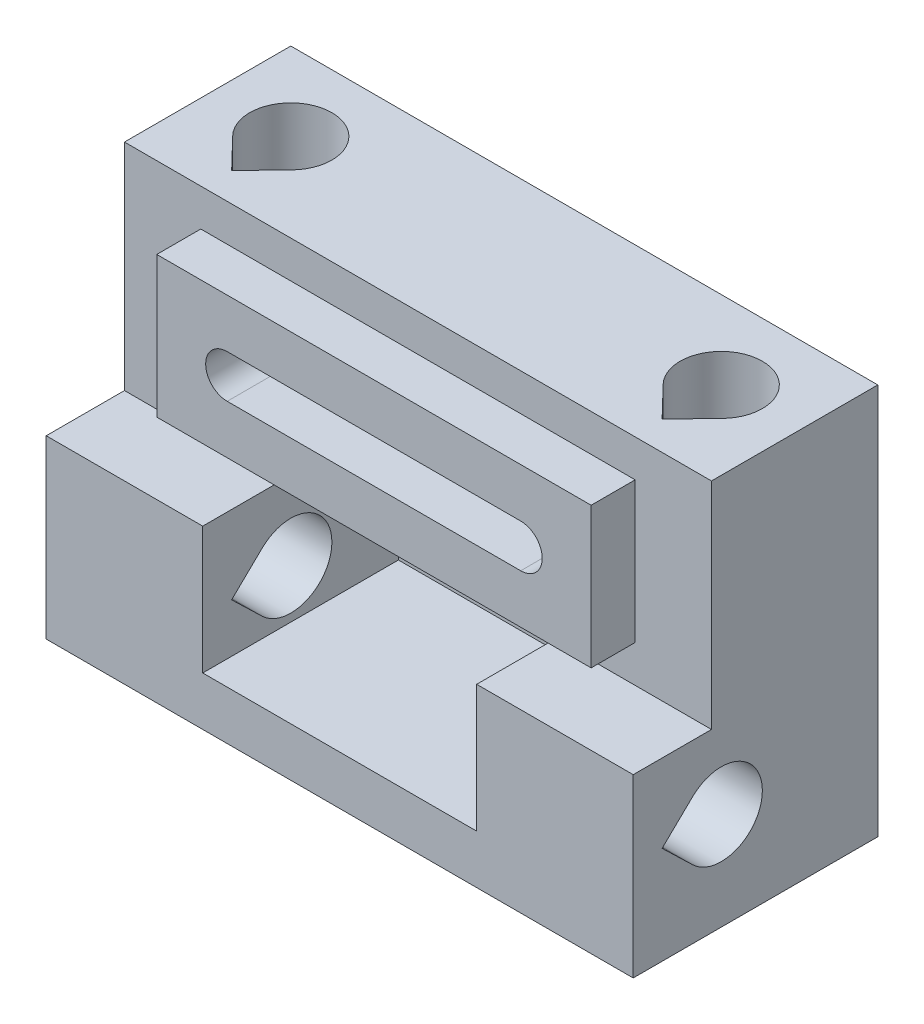
ISO-10303-21;
HEADER;
FILE_DESCRIPTION(('STEP AP214'),'2;1');
FILE_NAME('part.step','',(''),(''),'','','');
FILE_SCHEMA(('AUTOMOTIVE_DESIGN { 1 0 10303 214 1 1 1 1 }'));
ENDSEC;
DATA;
#1=APPLICATION_CONTEXT('core data for automotive mechanical design processes');
#2=APPLICATION_PROTOCOL_DEFINITION('international standard','automotive_design',2000,#1);
#3=PRODUCT_CONTEXT('',#1,'mechanical');
#4=PRODUCT('Part','Part','',(#3));
#5=PRODUCT_RELATED_PRODUCT_CATEGORY('part','',(#4));
#6=PRODUCT_DEFINITION_FORMATION('','',#4);
#7=PRODUCT_DEFINITION_CONTEXT('part definition',#1,'design');
#8=PRODUCT_DEFINITION('design','',#6,#7);
#9=PRODUCT_DEFINITION_SHAPE('','',#8);
#10=(LENGTH_UNIT() NAMED_UNIT(*) SI_UNIT(.MILLI.,.METRE.));
#11=(NAMED_UNIT(*) PLANE_ANGLE_UNIT() SI_UNIT($,.RADIAN.));
#12=(NAMED_UNIT(*) SI_UNIT($,.STERADIAN.) SOLID_ANGLE_UNIT());
#13=UNCERTAINTY_MEASURE_WITH_UNIT(LENGTH_MEASURE(1.E-05),#10,'distance_accuracy_value','');
#14=(GEOMETRIC_REPRESENTATION_CONTEXT(3) GLOBAL_UNCERTAINTY_ASSIGNED_CONTEXT((#13)) GLOBAL_UNIT_ASSIGNED_CONTEXT((#10,
#11,#12)) REPRESENTATION_CONTEXT('',''));
#15=CARTESIAN_POINT('',(0.,0.,0.));
#16=DIRECTION('',(0.,0.,1.));
#17=DIRECTION('',(1.,0.,0.));
#18=AXIS2_PLACEMENT_3D('',#15,#16,#17);
#19=CARTESIAN_POINT('',(-30.,-11.,17.));
#20=DIRECTION('',(0.,0.,1.));
#21=DIRECTION('',(1.,0.,0.));
#22=AXIS2_PLACEMENT_3D('',#19,#20,#21);
#23=PLANE('',#22);
#24=DIRECTION('',(1.,0.,0.));
#25=VECTOR('',#24,1.);
#26=CARTESIAN_POINT('',(-30.,-11.,17.));
#27=LINE('',#26,#25);
#28=CARTESIAN_POINT('',(-30.,-11.,17.));
#29=VERTEX_POINT('',#28);
#30=CARTESIAN_POINT('',(-14.,-11.,17.));
#31=VERTEX_POINT('',#30);
#32=EDGE_CURVE('E595',#29,#31,#27,.T.);
#33=ORIENTED_EDGE('',*,*,#32,.T.);
#34=DIRECTION('',(-1.,0.,0.));
#35=VECTOR('',#34,1.);
#36=CARTESIAN_POINT('',(14.,-11.,17.));
#37=LINE('',#36,#35);
#38=CARTESIAN_POINT('',(14.,-11.,17.));
#39=VERTEX_POINT('',#38);
#40=EDGE_CURVE('E359',#39,#31,#37,.T.);
#41=ORIENTED_EDGE('',*,*,#40,.F.);
#42=DIRECTION('',(-1.,0.,0.));
#43=VECTOR('',#42,1.);
#44=CARTESIAN_POINT('',(30.,-11.,17.));
#45=LINE('',#44,#43);
#46=CARTESIAN_POINT('',(30.,-11.,17.));
#47=VERTEX_POINT('',#46);
#48=EDGE_CURVE('E371',#47,#39,#45,.T.);
#49=ORIENTED_EDGE('',*,*,#48,.F.);
#50=DIRECTION('',(0.,1.,0.));
#51=VECTOR('',#50,1.);
#52=CARTESIAN_POINT('',(30.,-11.,17.));
#53=LINE('',#52,#51);
#54=CARTESIAN_POINT('',(30.,11.,17.));
#55=VERTEX_POINT('',#54);
#56=EDGE_CURVE('E378',#47,#55,#53,.T.);
#57=ORIENTED_EDGE('',*,*,#56,.T.);
#58=DIRECTION('',(-1.,0.,0.));
#59=VECTOR('',#58,1.);
#60=CARTESIAN_POINT('',(30.,11.,17.));
#61=LINE('',#60,#59);
#62=CARTESIAN_POINT('',(-30.,11.,17.));
#63=VERTEX_POINT('',#62);
#64=EDGE_CURVE('E592',#55,#63,#61,.T.);
#65=ORIENTED_EDGE('',*,*,#64,.T.);
#66=DIRECTION('',(0.,-1.,0.));
#67=VECTOR('',#66,1.);
#68=CARTESIAN_POINT('',(-30.,11.,17.));
#69=LINE('',#68,#67);
#70=EDGE_CURVE('E600',#63,#29,#69,.T.);
#71=ORIENTED_EDGE('',*,*,#70,.T.);
#72=EDGE_LOOP('',(#33,#41,#49,#57,#65,#71));
#73=FACE_BOUND('',#72,.T.);
#74=DIRECTION('',(1.,0.,0.));
#75=VECTOR('',#74,1.);
#76=CARTESIAN_POINT('',(22.2,-7.2,17.));
#77=LINE('',#76,#75);
#78=CARTESIAN_POINT('',(-22.2,-7.2,17.));
#79=VERTEX_POINT('',#78);
#80=CARTESIAN_POINT('',(22.2,-7.2,17.));
#81=VERTEX_POINT('',#80);
#82=EDGE_CURVE('E330',#79,#81,#77,.T.);
#83=ORIENTED_EDGE('',*,*,#82,.F.);
#84=DIRECTION('',(0.,-1.,0.));
#85=VECTOR('',#84,1.);
#86=CARTESIAN_POINT('',(-22.2,-7.2,17.));
#87=LINE('',#86,#85);
#88=CARTESIAN_POINT('',(-22.2,7.2,17.));
#89=VERTEX_POINT('',#88);
#90=EDGE_CURVE('E313',#89,#79,#87,.T.);
#91=ORIENTED_EDGE('',*,*,#90,.F.);
#92=DIRECTION('',(-1.,0.,0.));
#93=VECTOR('',#92,1.);
#94=CARTESIAN_POINT('',(-22.2,7.2,17.));
#95=LINE('',#94,#93);
#96=CARTESIAN_POINT('',(22.2,7.2,17.));
#97=VERTEX_POINT('',#96);
#98=EDGE_CURVE('E321',#97,#89,#95,.T.);
#99=ORIENTED_EDGE('',*,*,#98,.F.);
#100=DIRECTION('',(0.,1.,0.));
#101=VECTOR('',#100,1.);
#102=CARTESIAN_POINT('',(22.2,7.2,17.));
#103=LINE('',#102,#101);
#104=EDGE_CURVE('E332',#81,#97,#103,.T.);
#105=ORIENTED_EDGE('',*,*,#104,.F.);
#106=EDGE_LOOP('',(#83,#91,#99,#105));
#107=FACE_BOUND('',#106,.T.);
#108=ADVANCED_FACE('F48',(#73,#107),#23,.T.);
#109=CARTESIAN_POINT('',(-30.,-29.,25.));
#110=DIRECTION('',(0.,0.,-1.));
#111=DIRECTION('',(-1.,0.,0.));
#112=AXIS2_PLACEMENT_3D('',#109,#110,#111);
#113=PLANE('',#112);
#114=DIRECTION('',(1.,0.,0.));
#115=VECTOR('',#114,1.);
#116=CARTESIAN_POINT('',(-14.,-24.,25.));
#117=LINE('',#116,#115);
#118=CARTESIAN_POINT('',(-14.,-24.,25.));
#119=VERTEX_POINT('',#118);
#120=CARTESIAN_POINT('',(14.,-24.,25.));
#121=VERTEX_POINT('',#120);
#122=EDGE_CURVE('E348',#119,#121,#117,.T.);
#123=ORIENTED_EDGE('',*,*,#122,.F.);
#124=DIRECTION('',(0.,-1.,0.));
#125=VECTOR('',#124,1.);
#126=CARTESIAN_POINT('',(-14.,-11.,25.));
#127=LINE('',#126,#125);
#128=CARTESIAN_POINT('',(-14.,-11.,25.));
#129=VERTEX_POINT('',#128);
#130=EDGE_CURVE('E390',#129,#119,#127,.T.);
#131=ORIENTED_EDGE('',*,*,#130,.F.);
#132=DIRECTION('',(1.,0.,0.));
#133=VECTOR('',#132,1.);
#134=CARTESIAN_POINT('',(-30.,-11.,25.));
#135=LINE('',#134,#133);
#136=CARTESIAN_POINT('',(-30.,-11.,25.));
#137=VERTEX_POINT('',#136);
#138=EDGE_CURVE('E578',#137,#129,#135,.T.);
#139=ORIENTED_EDGE('',*,*,#138,.F.);
#140=DIRECTION('',(0.,1.,0.));
#141=VECTOR('',#140,1.);
#142=CARTESIAN_POINT('',(-30.,-29.,25.));
#143=LINE('',#142,#141);
#144=CARTESIAN_POINT('',(-30.,-29.,25.));
#145=VERTEX_POINT('',#144);
#146=EDGE_CURVE('E574',#145,#137,#143,.T.);
#147=ORIENTED_EDGE('',*,*,#146,.F.);
#148=DIRECTION('',(1.,0.,0.));
#149=VECTOR('',#148,1.);
#150=CARTESIAN_POINT('',(-30.,-29.,25.));
#151=LINE('',#150,#149);
#152=CARTESIAN_POINT('',(30.,-29.,25.));
#153=VERTEX_POINT('',#152);
#154=EDGE_CURVE('E774',#145,#153,#151,.T.);
#155=ORIENTED_EDGE('',*,*,#154,.T.);
#156=DIRECTION('',(0.,1.,0.));
#157=VECTOR('',#156,1.);
#158=CARTESIAN_POINT('',(30.,-29.,25.));
#159=LINE('',#158,#157);
#160=CARTESIAN_POINT('',(30.,-11.,25.));
#161=VERTEX_POINT('',#160);
#162=EDGE_CURVE('E587',#153,#161,#159,.T.);
#163=ORIENTED_EDGE('',*,*,#162,.T.);
#164=DIRECTION('',(1.,0.,0.));
#165=VECTOR('',#164,1.);
#166=CARTESIAN_POINT('',(14.,-11.,25.));
#167=LINE('',#166,#165);
#168=CARTESIAN_POINT('',(14.,-11.,25.));
#169=VERTEX_POINT('',#168);
#170=EDGE_CURVE('E376',#169,#161,#167,.T.);
#171=ORIENTED_EDGE('',*,*,#170,.F.);
#172=DIRECTION('',(0.,1.,0.));
#173=VECTOR('',#172,1.);
#174=CARTESIAN_POINT('',(14.,-24.,25.));
#175=LINE('',#174,#173);
#176=EDGE_CURVE('E386',#121,#169,#175,.T.);
#177=ORIENTED_EDGE('',*,*,#176,.F.);
#178=EDGE_LOOP('',(#123,#131,#139,#147,#155,#163,#171,#177));
#179=FACE_BOUND('',#178,.T.);
#180=ADVANCED_FACE('F451',(#179),#113,.F.);
#181=CARTESIAN_POINT('',(-46.3217875184488,-19.,16.));
#182=DIRECTION('',(1.,0.,0.));
#183=DIRECTION('',(0.,0.,-1.));
#184=AXIS2_PLACEMENT_3D('',#181,#182,#183);
#185=CYLINDRICAL_SURFACE('',#184,4.2);
#186=CARTESIAN_POINT('',(14.,-19.,16.));
#187=DIRECTION('',(1.,0.,0.));
#188=DIRECTION('',(0.,1.,0.));
#189=AXIS2_PLACEMENT_3D('',#186,#187,#188);
#190=CIRCLE('',#189,4.2);
#191=CARTESIAN_POINT('',(14.,-14.8006396803432,15.9266998929634));
#192=VERTEX_POINT('',#191);
#193=CARTESIAN_POINT('',(14.,-22.0212271614223,18.9175651559278));
#194=VERTEX_POINT('',#193);
#195=EDGE_CURVE('E403',#192,#194,#190,.F.);
#196=ORIENTED_EDGE('',*,*,#195,.T.);
#197=DIRECTION('',(1.,0.,0.));
#198=VECTOR('',#197,1.);
#199=CARTESIAN_POINT('',(-46.3217875184488,-22.0212271614223,18.9175651559278));
#200=LINE('',#199,#198);
#201=CARTESIAN_POINT('',(30.,-22.0212271614223,18.9175651559278));
#202=VERTEX_POINT('',#201);
#203=EDGE_CURVE('E486',#194,#202,#200,.T.);
#204=ORIENTED_EDGE('',*,*,#203,.T.);
#205=CARTESIAN_POINT('',(30.,-19.,16.));
#206=DIRECTION('',(1.,0.,0.));
#207=DIRECTION('',(0.,0.,1.));
#208=AXIS2_PLACEMENT_3D('',#205,#206,#207);
#209=CIRCLE('',#208,4.2);
#210=CARTESIAN_POINT('',(30.,-15.9787728385777,18.9175651559278));
#211=VERTEX_POINT('',#210);
#212=EDGE_CURVE('E482',#202,#211,#209,.T.);
#213=ORIENTED_EDGE('',*,*,#212,.T.);
#214=DIRECTION('',(1.,0.,0.));
#215=VECTOR('',#214,1.);
#216=CARTESIAN_POINT('',(-46.3217875184488,-15.9787728385777,18.9175651559278));
#217=LINE('',#216,#215);
#218=CARTESIAN_POINT('',(14.,-15.9787728385777,18.9175651559278));
#219=VERTEX_POINT('',#218);
#220=EDGE_CURVE('E498',#219,#211,#217,.T.);
#221=ORIENTED_EDGE('',*,*,#220,.F.);
#222=CARTESIAN_POINT('',(14.,-14.8006396803432,16.0733001070366));
#223=VERTEX_POINT('',#222);
#224=EDGE_CURVE('E412',#219,#223,#190,.F.);
#225=ORIENTED_EDGE('',*,*,#224,.T.);
#226=CARTESIAN_POINT('',(14.,-14.8006396803432,15.9266998929634));
#227=CARTESIAN_POINT('',(14.,-14.7993794256245,16.));
#228=CARTESIAN_POINT('',(14.,-14.8006396803432,16.0733001070366));
#229=B_SPLINE_CURVE_WITH_KNOTS('',2,(#226,#227,#228),.UNSPECIFIED.,.F.,.F.,(3,3),(0.,1.),.UNSPECIFIED.);
#230=EDGE_CURVE('E381',#192,#223,#229,.T.);
#231=ORIENTED_EDGE('',*,*,#230,.F.);
#232=EDGE_LOOP('',(#196,#204,#213,#221,#225,#231));
#233=FACE_BOUND('',#232,.T.);
#234=CARTESIAN_POINT('',(23.8868231161865,-19.,16.));
#235=DIRECTION('',(-0.719339800338651,0.,0.694658370458997));
#236=DIRECTION('',(0.694658370458998,0.,0.719339800338651));
#237=AXIS2_PLACEMENT_3D('',#234,#235,#236);
#238=ELLIPSE('',#237,5.83868708227005,4.2);
#239=CARTESIAN_POINT('',(22.,-15.2821483085115,14.046137466428));
#240=VERTEX_POINT('',#239);
#241=CARTESIAN_POINT('',(22.,-22.7178516914885,14.046137466428));
#242=VERTEX_POINT('',#241);
#243=EDGE_CURVE('E503',#240,#242,#238,.T.);
#244=ORIENTED_EDGE('',*,*,#243,.F.);
#245=CARTESIAN_POINT('',(20.1131768838134,-19.,16.));
#246=DIRECTION('',(0.71933980033865,0.,0.694658370458998));
#247=DIRECTION('',(0.694658370458998,0.,-0.71933980033865));
#248=AXIS2_PLACEMENT_3D('',#245,#246,#247);
#249=ELLIPSE('',#248,5.83868708227006,4.2);
#250=EDGE_CURVE('E627',#242,#240,#249,.T.);
#251=ORIENTED_EDGE('',*,*,#250,.F.);
#252=EDGE_LOOP('',(#244,#251));
#253=FACE_BOUND('',#252,.T.);
#254=ADVANCED_FACE('F433',(#233,#253),#185,.F.);
#255=CARTESIAN_POINT('',(-14.,-11.,5.));
#256=DIRECTION('',(-1.,0.,0.));
#257=DIRECTION('',(0.,0.,1.));
#258=AXIS2_PLACEMENT_3D('',#255,#256,#257);
#259=PLANE('',#258);
#260=CARTESIAN_POINT('',(-14.,-19.,16.));
#261=DIRECTION('',(-1.,0.,0.));
#262=DIRECTION('',(0.,0.,1.));
#263=AXIS2_PLACEMENT_3D('',#260,#261,#262);
#264=CIRCLE('',#263,4.2);
#265=CARTESIAN_POINT('',(-14.,-22.0212271614223,18.9175651559278));
#266=VERTEX_POINT('',#265);
#267=CARTESIAN_POINT('',(-14.,-14.8006396803432,15.9266998929632));
#268=VERTEX_POINT('',#267);
#269=EDGE_CURVE('E473',#266,#268,#264,.F.);
#270=ORIENTED_EDGE('',*,*,#269,.F.);
#271=DIRECTION('',(0.,-0.694658370458997,-0.719339800338651));
#272=VECTOR('',#271,1.);
#273=CARTESIAN_POINT('',(-14.,-19.,22.046137466428));
#274=LINE('',#273,#272);
#275=CARTESIAN_POINT('',(-14.,-19.,22.046137466428));
#276=VERTEX_POINT('',#275);
#277=EDGE_CURVE('E11',#276,#266,#274,.T.);
#278=ORIENTED_EDGE('',*,*,#277,.F.);
#279=DIRECTION('',(0.,-0.694658370458997,0.719339800338651));
#280=VECTOR('',#279,1.);
#281=CARTESIAN_POINT('',(-14.,-15.9787728385777,18.9175651559278));
#282=LINE('',#281,#280);
#283=CARTESIAN_POINT('',(-14.,-15.9787728385777,18.9175651559278));
#284=VERTEX_POINT('',#283);
#285=EDGE_CURVE('E406',#284,#276,#282,.T.);
#286=ORIENTED_EDGE('',*,*,#285,.F.);
#287=CARTESIAN_POINT('',(-14.,-14.8006396803432,16.0733001070368));
#288=VERTEX_POINT('',#287);
#289=EDGE_CURVE('E471',#288,#284,#264,.F.);
#290=ORIENTED_EDGE('',*,*,#289,.F.);
#291=CARTESIAN_POINT('',(-14.,-19.,16.));
#292=DIRECTION('',(1.,0.,0.));
#293=DIRECTION('',(0.,0.99984769515639,-0.0174524064373345));
#294=AXIS2_PLACEMENT_3D('',#291,#292,#293);
#295=CIRCLE('',#294,4.2);
#296=EDGE_CURVE('E393',#268,#288,#295,.T.);
#297=ORIENTED_EDGE('',*,*,#296,.F.);
#298=EDGE_LOOP('',(#270,#278,#286,#290,#297));
#299=FACE_BOUND('',#298,.T.);
#300=DIRECTION('',(0.,0.,-1.));
#301=VECTOR('',#300,1.);
#302=CARTESIAN_POINT('',(-14.,-11.,17.));
#303=LINE('',#302,#301);
#304=CARTESIAN_POINT('',(-14.,-11.,5.));
#305=VERTEX_POINT('',#304);
#306=EDGE_CURVE('E362',#31,#305,#303,.T.);
#307=ORIENTED_EDGE('',*,*,#306,.F.);
#308=DIRECTION('',(0.,0.,1.));
#309=VECTOR('',#308,1.);
#310=CARTESIAN_POINT('',(-14.,-11.,5.));
#311=LINE('',#310,#309);
#312=EDGE_CURVE('E389',#31,#129,#311,.T.);
#313=ORIENTED_EDGE('',*,*,#312,.T.);
#314=ORIENTED_EDGE('',*,*,#130,.T.);
#315=DIRECTION('',(0.,0.,1.));
#316=VECTOR('',#315,1.);
#317=CARTESIAN_POINT('',(-14.,-24.,5.));
#318=LINE('',#317,#316);
#319=CARTESIAN_POINT('',(-14.,-24.,5.));
#320=VERTEX_POINT('',#319);
#321=EDGE_CURVE('E345',#320,#119,#318,.T.);
#322=ORIENTED_EDGE('',*,*,#321,.F.);
#323=DIRECTION('',(0.,-1.,0.));
#324=VECTOR('',#323,1.);
#325=CARTESIAN_POINT('',(-14.,-11.,5.));
#326=LINE('',#325,#324);
#327=EDGE_CURVE('E382',#305,#320,#326,.T.);
#328=ORIENTED_EDGE('',*,*,#327,.F.);
#329=EDGE_LOOP('',(#307,#313,#314,#322,#328));
#330=FACE_BOUND('',#329,.T.);
#331=ADVANCED_FACE('F423',(#299,#330),#259,.F.);
#332=CARTESIAN_POINT('',(14.,-24.,5.));
#333=DIRECTION('',(1.,0.,0.));
#334=DIRECTION('',(0.,1.,0.));
#335=AXIS2_PLACEMENT_3D('',#332,#333,#334);
#336=PLANE('',#335);
#337=DIRECTION('',(0.,0.694658370458997,0.719339800338651));
#338=VECTOR('',#337,1.);
#339=CARTESIAN_POINT('',(14.,-19.,22.046137466428));
#340=LINE('',#339,#338);
#341=CARTESIAN_POINT('',(14.,-19.,22.046137466428));
#342=VERTEX_POINT('',#341);
#343=EDGE_CURVE('E60',#194,#342,#340,.T.);
#344=ORIENTED_EDGE('',*,*,#343,.F.);
#345=ORIENTED_EDGE('',*,*,#195,.F.);
#346=ORIENTED_EDGE('',*,*,#230,.T.);
#347=ORIENTED_EDGE('',*,*,#224,.F.);
#348=DIRECTION('',(0.,0.694658370458997,-0.719339800338651));
#349=VECTOR('',#348,1.);
#350=CARTESIAN_POINT('',(14.,-15.9787728385777,18.9175651559278));
#351=LINE('',#350,#349);
#352=EDGE_CURVE('E399',#342,#219,#351,.T.);
#353=ORIENTED_EDGE('',*,*,#352,.F.);
#354=EDGE_LOOP('',(#344,#345,#346,#347,#353));
#355=FACE_BOUND('',#354,.T.);
#356=DIRECTION('',(0.,0.,1.));
#357=VECTOR('',#356,1.);
#358=CARTESIAN_POINT('',(14.,-11.,17.));
#359=LINE('',#358,#357);
#360=EDGE_CURVE('E374',#39,#169,#359,.T.);
#361=ORIENTED_EDGE('',*,*,#360,.F.);
#362=DIRECTION('',(0.,0.,1.));
#363=VECTOR('',#362,1.);
#364=CARTESIAN_POINT('',(14.,-11.,5.));
#365=LINE('',#364,#363);
#366=CARTESIAN_POINT('',(14.,-11.,5.));
#367=VERTEX_POINT('',#366);
#368=EDGE_CURVE('E357',#367,#39,#365,.T.);
#369=ORIENTED_EDGE('',*,*,#368,.F.);
#370=DIRECTION('',(0.,1.,0.));
#371=VECTOR('',#370,1.);
#372=CARTESIAN_POINT('',(14.,-24.,5.));
#373=LINE('',#372,#371);
#374=CARTESIAN_POINT('',(14.,-24.,5.));
#375=VERTEX_POINT('',#374);
#376=EDGE_CURVE('E385',#375,#367,#373,.T.);
#377=ORIENTED_EDGE('',*,*,#376,.F.);
#378=DIRECTION('',(0.,0.,-1.));
#379=VECTOR('',#378,1.);
#380=CARTESIAN_POINT('',(14.,-24.,25.));
#381=LINE('',#380,#379);
#382=EDGE_CURVE('E351',#121,#375,#381,.T.);
#383=ORIENTED_EDGE('',*,*,#382,.F.);
#384=ORIENTED_EDGE('',*,*,#176,.T.);
#385=EDGE_LOOP('',(#361,#369,#377,#383,#384));
#386=FACE_BOUND('',#385,.T.);
#387=ADVANCED_FACE('F432',(#355,#386),#336,.F.);
#388=CARTESIAN_POINT('',(-14.,-11.,5.));
#389=DIRECTION('',(0.,0.,1.));
#390=DIRECTION('',(1.,0.,0.));
#391=AXIS2_PLACEMENT_3D('',#388,#389,#390);
#392=PLANE('',#391);
#393=ORIENTED_EDGE('',*,*,#376,.T.);
#394=DIRECTION('',(1.,0.,0.));
#395=VECTOR('',#394,1.);
#396=CARTESIAN_POINT('',(-14.,-11.,5.));
#397=LINE('',#396,#395);
#398=EDGE_CURVE('E365',#305,#367,#397,.T.);
#399=ORIENTED_EDGE('',*,*,#398,.F.);
#400=ORIENTED_EDGE('',*,*,#327,.T.);
#401=DIRECTION('',(-1.,0.,0.));
#402=VECTOR('',#401,1.);
#403=CARTESIAN_POINT('',(14.,-24.,5.));
#404=LINE('',#403,#402);
#405=EDGE_CURVE('E354',#375,#320,#404,.T.);
#406=ORIENTED_EDGE('',*,*,#405,.F.);
#407=EDGE_LOOP('',(#393,#399,#400,#406));
#408=FACE_BOUND('',#407,.T.);
#409=ADVANCED_FACE('F1078',(#408),#392,.T.);
#410=CARTESIAN_POINT('',(-30.,-11.,0.));
#411=DIRECTION('',(0.,0.,1.));
#412=DIRECTION('',(1.,0.,0.));
#413=AXIS2_PLACEMENT_3D('',#410,#411,#412);
#414=PLANE('',#413);
#415=DIRECTION('',(-1.,0.,0.));
#416=VECTOR('',#415,1.);
#417=CARTESIAN_POINT('',(15.,2.2,0.));
#418=LINE('',#417,#416);
#419=CARTESIAN_POINT('',(15.,2.2,0.));
#420=VERTEX_POINT('',#419);
#421=CARTESIAN_POINT('',(-15.,2.2,0.));
#422=VERTEX_POINT('',#421);
#423=EDGE_CURVE('E288',#420,#422,#418,.T.);
#424=ORIENTED_EDGE('',*,*,#423,.T.);
#425=CARTESIAN_POINT('',(-15.,0.,0.));
#426=DIRECTION('',(0.,0.,1.));
#427=DIRECTION('',(1.,0.,0.));
#428=AXIS2_PLACEMENT_3D('',#425,#426,#427);
#429=CIRCLE('',#428,2.2);
#430=CARTESIAN_POINT('',(-15.,-2.2,0.));
#431=VERTEX_POINT('',#430);
#432=EDGE_CURVE('E282',#422,#431,#429,.T.);
#433=ORIENTED_EDGE('',*,*,#432,.T.);
#434=DIRECTION('',(1.,0.,0.));
#435=VECTOR('',#434,1.);
#436=CARTESIAN_POINT('',(-15.,-2.2,0.));
#437=LINE('',#436,#435);
#438=CARTESIAN_POINT('',(15.,-2.2,0.));
#439=VERTEX_POINT('',#438);
#440=EDGE_CURVE('E291',#431,#439,#437,.T.);
#441=ORIENTED_EDGE('',*,*,#440,.T.);
#442=CARTESIAN_POINT('',(15.,0.,0.));
#443=DIRECTION('',(0.,0.,1.));
#444=DIRECTION('',(1.,0.,0.));
#445=AXIS2_PLACEMENT_3D('',#442,#443,#444);
#446=CIRCLE('',#445,2.2);
#447=EDGE_CURVE('E68',#439,#420,#446,.T.);
#448=ORIENTED_EDGE('',*,*,#447,.T.);
#449=EDGE_LOOP('',(#424,#433,#441,#448));
#450=FACE_BOUND('',#449,.T.);
#451=DIRECTION('',(0.,-1.,0.));
#452=VECTOR('',#451,1.);
#453=CARTESIAN_POINT('',(-30.,11.,0.));
#454=LINE('',#453,#452);
#455=CARTESIAN_POINT('',(-30.,11.,0.));
#456=VERTEX_POINT('',#455);
#457=CARTESIAN_POINT('',(-30.,-29.,0.));
#458=VERTEX_POINT('',#457);
#459=EDGE_CURVE('E752',#456,#458,#454,.T.);
#460=ORIENTED_EDGE('',*,*,#459,.F.);
#461=DIRECTION('',(-1.,0.,0.));
#462=VECTOR('',#461,1.);
#463=CARTESIAN_POINT('',(30.,11.,0.));
#464=LINE('',#463,#462);
#465=CARTESIAN_POINT('',(30.,11.,0.));
#466=VERTEX_POINT('',#465);
#467=EDGE_CURVE('E606',#466,#456,#464,.T.);
#468=ORIENTED_EDGE('',*,*,#467,.F.);
#469=DIRECTION('',(0.,1.,0.));
#470=VECTOR('',#469,1.);
#471=CARTESIAN_POINT('',(30.,-11.,0.));
#472=LINE('',#471,#470);
#473=CARTESIAN_POINT('',(30.,-29.,0.));
#474=VERTEX_POINT('',#473);
#475=EDGE_CURVE('E755',#474,#466,#472,.T.);
#476=ORIENTED_EDGE('',*,*,#475,.F.);
#477=DIRECTION('',(1.,0.,0.));
#478=VECTOR('',#477,1.);
#479=CARTESIAN_POINT('',(-30.,-29.,0.));
#480=LINE('',#479,#478);
#481=EDGE_CURVE('E588',#458,#474,#480,.T.);
#482=ORIENTED_EDGE('',*,*,#481,.F.);
#483=EDGE_LOOP('',(#460,#468,#476,#482));
#484=FACE_BOUND('',#483,.T.);
#485=ADVANCED_FACE('F295',(#450,#484),#414,.F.);
#486=CARTESIAN_POINT('',(-30.,-11.,25.));
#487=DIRECTION('',(0.,-1.,0.));
#488=DIRECTION('',(0.,0.,-1.));
#489=AXIS2_PLACEMENT_3D('',#486,#487,#488);
#490=PLANE('',#489);
#491=ORIENTED_EDGE('',*,*,#138,.T.);
#492=ORIENTED_EDGE('',*,*,#312,.F.);
#493=ORIENTED_EDGE('',*,*,#32,.F.);
#494=DIRECTION('',(0.,0.,-1.));
#495=VECTOR('',#494,1.);
#496=CARTESIAN_POINT('',(-30.,-11.,25.));
#497=LINE('',#496,#495);
#498=EDGE_CURVE('E575',#137,#29,#497,.T.);
#499=ORIENTED_EDGE('',*,*,#498,.F.);
#500=EDGE_LOOP('',(#491,#492,#493,#499));
#501=FACE_BOUND('',#500,.T.);
#502=ADVANCED_FACE('F1099',(#501),#490,.F.);
#503=CARTESIAN_POINT('',(-30.,-22.0212271614223,18.9175651559278));
#504=VERTEX_POINT('',#503);
#505=EDGE_CURVE('E489',#504,#266,#200,.T.);
#506=ORIENTED_EDGE('',*,*,#505,.T.);
#507=ORIENTED_EDGE('',*,*,#269,.T.);
#508=ORIENTED_EDGE('',*,*,#296,.T.);
#509=ORIENTED_EDGE('',*,*,#289,.T.);
#510=CARTESIAN_POINT('',(-30.,-15.9787728385777,18.9175651559278));
#511=VERTEX_POINT('',#510);
#512=EDGE_CURVE('E499',#511,#284,#217,.T.);
#513=ORIENTED_EDGE('',*,*,#512,.F.);
#514=CARTESIAN_POINT('',(-30.,-19.,16.));
#515=DIRECTION('',(1.,0.,0.));
#516=DIRECTION('',(0.,0.,-1.));
#517=AXIS2_PLACEMENT_3D('',#514,#515,#516);
#518=CIRCLE('',#517,4.2);
#519=EDGE_CURVE('E513',#504,#511,#518,.T.);
#520=ORIENTED_EDGE('',*,*,#519,.F.);
#521=EDGE_LOOP('',(#506,#507,#508,#509,#513,#520));
#522=FACE_BOUND('',#521,.T.);
#523=CARTESIAN_POINT('',(-20.1131768838135,-19.,16.));
#524=DIRECTION('',(-0.719339800338651,0.,0.694658370458997));
#525=DIRECTION('',(0.694658370458998,0.,0.719339800338651));
#526=AXIS2_PLACEMENT_3D('',#523,#524,#525);
#527=ELLIPSE('',#526,5.83868708227005,4.2);
#528=CARTESIAN_POINT('',(-22.,-15.2821483085115,14.046137466428));
#529=VERTEX_POINT('',#528);
#530=CARTESIAN_POINT('',(-22.,-22.7178516914885,14.046137466428));
#531=VERTEX_POINT('',#530);
#532=EDGE_CURVE('E509',#529,#531,#527,.T.);
#533=ORIENTED_EDGE('',*,*,#532,.F.);
#534=CARTESIAN_POINT('',(-23.8868231161865,-19.,16.));
#535=DIRECTION('',(0.719339800338651,0.,0.694658370458998));
#536=DIRECTION('',(0.694658370458998,0.,-0.719339800338651));
#537=AXIS2_PLACEMENT_3D('',#534,#535,#536);
#538=ELLIPSE('',#537,5.83868708227005,4.2);
#539=EDGE_CURVE('E506',#531,#529,#538,.T.);
#540=ORIENTED_EDGE('',*,*,#539,.F.);
#541=EDGE_LOOP('',(#533,#540));
#542=FACE_BOUND('',#541,.T.);
#543=ADVANCED_FACE('F453',(#522,#542),#185,.F.);
#544=CARTESIAN_POINT('',(-46.3217875184488,-15.9787728385777,18.9175651559278));
#545=DIRECTION('',(0.,0.719339800338651,0.694658370458997));
#546=DIRECTION('',(0.,-0.694658370458997,0.719339800338651));
#547=AXIS2_PLACEMENT_3D('',#544,#545,#546);
#548=PLANE('',#547);
#549=ORIENTED_EDGE('',*,*,#512,.T.);
#550=ORIENTED_EDGE('',*,*,#285,.T.);
#551=DIRECTION('',(1.,0.,0.));
#552=VECTOR('',#551,1.);
#553=CARTESIAN_POINT('',(-46.3217875184488,-19.,22.046137466428));
#554=LINE('',#553,#552);
#555=CARTESIAN_POINT('',(-30.,-19.,22.046137466428));
#556=VERTEX_POINT('',#555);
#557=EDGE_CURVE('E494',#556,#276,#554,.T.);
#558=ORIENTED_EDGE('',*,*,#557,.F.);
#559=DIRECTION('',(0.,-0.694658370458997,0.719339800338651));
#560=VECTOR('',#559,1.);
#561=CARTESIAN_POINT('',(-30.,-2.00196070262473,4.4441524989926));
#562=LINE('',#561,#560);
#563=EDGE_CURVE('E520',#511,#556,#562,.T.);
#564=ORIENTED_EDGE('',*,*,#563,.F.);
#565=EDGE_LOOP('',(#549,#550,#558,#564));
#566=FACE_BOUND('',#565,.T.);
#567=ADVANCED_FACE('F447',(#566),#548,.F.);
#568=CARTESIAN_POINT('',(-46.3217875184488,-19.,22.046137466428));
#569=DIRECTION('',(0.,-0.719339800338651,0.694658370458997));
#570=DIRECTION('',(0.,-0.694658370458997,-0.719339800338651));
#571=AXIS2_PLACEMENT_3D('',#568,#569,#570);
#572=PLANE('',#571);
#573=ORIENTED_EDGE('',*,*,#557,.T.);
#574=ORIENTED_EDGE('',*,*,#277,.T.);
#575=ORIENTED_EDGE('',*,*,#505,.F.);
#576=DIRECTION('',(0.,-0.694658370458997,-0.719339800338651));
#577=VECTOR('',#576,1.);
#578=CARTESIAN_POINT('',(-30.,-7.0450241984503,34.4258773095655));
#579=LINE('',#578,#577);
#580=EDGE_CURVE('E516',#556,#504,#579,.T.);
#581=ORIENTED_EDGE('',*,*,#580,.F.);
#582=EDGE_LOOP('',(#573,#574,#575,#581));
#583=FACE_BOUND('',#582,.T.);
#584=ADVANCED_FACE('F442',(#583),#572,.F.);
#585=CARTESIAN_POINT('',(-30.,11.,17.));
#586=DIRECTION('',(1.,0.,0.));
#587=DIRECTION('',(0.,0.,-1.));
#588=AXIS2_PLACEMENT_3D('',#585,#586,#587);
#589=PLANE('',#588);
#590=ORIENTED_EDGE('',*,*,#580,.T.);
#591=ORIENTED_EDGE('',*,*,#519,.T.);
#592=ORIENTED_EDGE('',*,*,#563,.T.);
#593=EDGE_LOOP('',(#590,#591,#592));
#594=FACE_BOUND('',#593,.T.);
#595=ORIENTED_EDGE('',*,*,#459,.T.);
#596=DIRECTION('',(0.,0.,1.));
#597=VECTOR('',#596,1.);
#598=CARTESIAN_POINT('',(-30.,-29.,0.));
#599=LINE('',#598,#597);
#600=EDGE_CURVE('E571',#458,#145,#599,.T.);
#601=ORIENTED_EDGE('',*,*,#600,.T.);
#602=ORIENTED_EDGE('',*,*,#146,.T.);
#603=ORIENTED_EDGE('',*,*,#498,.T.);
#604=ORIENTED_EDGE('',*,*,#70,.F.);
#605=DIRECTION('',(0.,0.,-1.));
#606=VECTOR('',#605,1.);
#607=CARTESIAN_POINT('',(-30.,11.,17.));
#608=LINE('',#607,#606);
#609=EDGE_CURVE('E601',#63,#456,#608,.T.);
#610=ORIENTED_EDGE('',*,*,#609,.T.);
#611=EDGE_LOOP('',(#595,#601,#602,#603,#604,#610));
#612=FACE_BOUND('',#611,.T.);
#613=ADVANCED_FACE('F50',(#594,#612),#589,.F.);
#614=CARTESIAN_POINT('',(30.,-11.,17.));
#615=DIRECTION('',(-1.,0.,0.));
#616=DIRECTION('',(0.,0.,1.));
#617=AXIS2_PLACEMENT_3D('',#614,#615,#616);
#618=PLANE('',#617);
#619=DIRECTION('',(0.,0.,-1.));
#620=VECTOR('',#619,1.);
#621=CARTESIAN_POINT('',(30.,11.,17.));
#622=LINE('',#621,#620);
#623=EDGE_CURVE('E622',#55,#466,#622,.T.);
#624=ORIENTED_EDGE('',*,*,#623,.F.);
#625=ORIENTED_EDGE('',*,*,#56,.F.);
#626=DIRECTION('',(0.,0.,-1.));
#627=VECTOR('',#626,1.);
#628=CARTESIAN_POINT('',(30.,-11.,25.));
#629=LINE('',#628,#627);
#630=EDGE_CURVE('E368',#161,#47,#629,.T.);
#631=ORIENTED_EDGE('',*,*,#630,.F.);
#632=ORIENTED_EDGE('',*,*,#162,.F.);
#633=DIRECTION('',(0.,0.,1.));
#634=VECTOR('',#633,1.);
#635=CARTESIAN_POINT('',(30.,-29.,0.));
#636=LINE('',#635,#634);
#637=EDGE_CURVE('E570',#474,#153,#636,.T.);
#638=ORIENTED_EDGE('',*,*,#637,.F.);
#639=ORIENTED_EDGE('',*,*,#475,.T.);
#640=EDGE_LOOP('',(#624,#625,#631,#632,#638,#639));
#641=FACE_BOUND('',#640,.T.);
#642=ORIENTED_EDGE('',*,*,#212,.F.);
#643=DIRECTION('',(0.,-0.694658370458997,-0.719339800338651));
#644=VECTOR('',#643,1.);
#645=CARTESIAN_POINT('',(30.,-19.,22.046137466428));
#646=LINE('',#645,#644);
#647=CARTESIAN_POINT('',(30.,-19.,22.046137466428));
#648=VERTEX_POINT('',#647);
#649=EDGE_CURVE('E481',#648,#202,#646,.T.);
#650=ORIENTED_EDGE('',*,*,#649,.F.);
#651=DIRECTION('',(0.,-0.694658370458997,0.719339800338651));
#652=VECTOR('',#651,1.);
#653=CARTESIAN_POINT('',(30.,-15.9787728385777,18.9175651559278));
#654=LINE('',#653,#652);
#655=EDGE_CURVE('E476',#211,#648,#654,.T.);
#656=ORIENTED_EDGE('',*,*,#655,.F.);
#657=EDGE_LOOP('',(#642,#650,#656));
#658=FACE_BOUND('',#657,.T.);
#659=ADVANCED_FACE('F1222',(#641,#658),#618,.F.);
#660=CARTESIAN_POINT('',(30.,11.,17.));
#661=DIRECTION('',(0.,-1.,0.));
#662=DIRECTION('',(1.,0.,0.));
#663=AXIS2_PLACEMENT_3D('',#660,#661,#662);
#664=PLANE('',#663);
#665=DIRECTION('',(0.694658370458998,0.,0.719339800338651));
#666=VECTOR('',#665,1.);
#667=CARTESIAN_POINT('',(18.9787728385777,11.,10.9175651559278));
#668=LINE('',#667,#666);
#669=CARTESIAN_POINT('',(18.9787728385777,11.,10.9175651559278));
#670=VERTEX_POINT('',#669);
#671=CARTESIAN_POINT('',(22.,11.,14.046137466428));
#672=VERTEX_POINT('',#671);
#673=EDGE_CURVE('E525',#670,#672,#668,.T.);
#674=ORIENTED_EDGE('',*,*,#673,.F.);
#675=CARTESIAN_POINT('',(22.,11.,7.99999999999999));
#676=DIRECTION('',(0.,1.,0.));
#677=DIRECTION('',(0.,0.,1.));
#678=AXIS2_PLACEMENT_3D('',#675,#676,#677);
#679=CIRCLE('',#678,4.2);
#680=CARTESIAN_POINT('',(25.0212271614223,11.,10.9175651559278));
#681=VERTEX_POINT('',#680);
#682=EDGE_CURVE('E524',#681,#670,#679,.T.);
#683=ORIENTED_EDGE('',*,*,#682,.F.);
#684=DIRECTION('',(0.694658370458998,0.,-0.71933980033865));
#685=VECTOR('',#684,1.);
#686=CARTESIAN_POINT('',(22.,11.,14.046137466428));
#687=LINE('',#686,#685);
#688=EDGE_CURVE('E529',#672,#681,#687,.T.);
#689=ORIENTED_EDGE('',*,*,#688,.F.);
#690=EDGE_LOOP('',(#674,#683,#689));
#691=FACE_BOUND('',#690,.T.);
#692=DIRECTION('',(0.694658370458998,0.,0.719339800338651));
#693=VECTOR('',#692,1.);
#694=CARTESIAN_POINT('',(-25.0212271614223,11.,10.9175651559278));
#695=LINE('',#694,#693);
#696=CARTESIAN_POINT('',(-25.0212271614223,11.,10.9175651559278));
#697=VERTEX_POINT('',#696);
#698=CARTESIAN_POINT('',(-22.,11.,14.046137466428));
#699=VERTEX_POINT('',#698);
#700=EDGE_CURVE('E548',#697,#699,#695,.T.);
#701=ORIENTED_EDGE('',*,*,#700,.F.);
#702=CARTESIAN_POINT('',(-22.,11.,7.99999999999999));
#703=DIRECTION('',(0.,1.,0.));
#704=DIRECTION('',(0.,0.,1.));
#705=AXIS2_PLACEMENT_3D('',#702,#703,#704);
#706=CIRCLE('',#705,4.2);
#707=CARTESIAN_POINT('',(-18.9787728385777,11.,10.9175651559278));
#708=VERTEX_POINT('',#707);
#709=EDGE_CURVE('E547',#708,#697,#706,.T.);
#710=ORIENTED_EDGE('',*,*,#709,.F.);
#711=DIRECTION('',(0.694658370458998,0.,-0.719339800338651));
#712=VECTOR('',#711,1.);
#713=CARTESIAN_POINT('',(-22.,11.,14.046137466428));
#714=LINE('',#713,#712);
#715=EDGE_CURVE('E552',#699,#708,#714,.T.);
#716=ORIENTED_EDGE('',*,*,#715,.F.);
#717=EDGE_LOOP('',(#701,#710,#716));
#718=FACE_BOUND('',#717,.T.);
#719=ORIENTED_EDGE('',*,*,#64,.F.);
#720=ORIENTED_EDGE('',*,*,#623,.T.);
#721=ORIENTED_EDGE('',*,*,#467,.T.);
#722=ORIENTED_EDGE('',*,*,#609,.F.);
#723=EDGE_LOOP('',(#719,#720,#721,#722));
#724=FACE_BOUND('',#723,.T.);
#725=ADVANCED_FACE('F1228',(#691,#718,#724),#664,.F.);
#726=CARTESIAN_POINT('',(-30.,-29.,0.));
#727=DIRECTION('',(0.,1.,0.));
#728=DIRECTION('',(0.,0.,1.));
#729=AXIS2_PLACEMENT_3D('',#726,#727,#728);
#730=PLANE('',#729);
#731=DIRECTION('',(0.694658370458998,0.,-0.71933980033865));
#732=VECTOR('',#731,1.);
#733=CARTESIAN_POINT('',(3.92617738376368,-29.,32.7621286716143));
#734=LINE('',#733,#732);
#735=CARTESIAN_POINT('',(22.,-29.,14.046137466428));
#736=VERTEX_POINT('',#735);
#737=CARTESIAN_POINT('',(25.0212271614223,-29.,10.9175651559278));
#738=VERTEX_POINT('',#737);
#739=EDGE_CURVE('E613',#736,#738,#734,.T.);
#740=ORIENTED_EDGE('',*,*,#739,.T.);
#741=CARTESIAN_POINT('',(22.,-29.,7.99999999999999));
#742=DIRECTION('',(0.,1.,0.));
#743=DIRECTION('',(0.,0.,1.));
#744=AXIS2_PLACEMENT_3D('',#741,#742,#743);
#745=CIRCLE('',#744,4.2);
#746=CARTESIAN_POINT('',(18.9787728385777,-29.,10.9175651559278));
#747=VERTEX_POINT('',#746);
#748=EDGE_CURVE('E623',#738,#747,#745,.T.);
#749=ORIENTED_EDGE('',*,*,#748,.T.);
#750=DIRECTION('',(0.694658370458998,0.,0.719339800338651));
#751=VECTOR('',#750,1.);
#752=CARTESIAN_POINT('',(-10.1114035552337,-29.,-19.2061943333787));
#753=LINE('',#752,#751);
#754=EDGE_CURVE('E628',#747,#736,#753,.T.);
#755=ORIENTED_EDGE('',*,*,#754,.T.);
#756=EDGE_LOOP('',(#740,#749,#755));
#757=FACE_BOUND('',#756,.T.);
#758=DIRECTION('',(0.694658370458998,0.,-0.719339800338651));
#759=VECTOR('',#758,1.);
#760=CARTESIAN_POINT('',(-18.8416115436913,-29.,10.7755304771942));
#761=LINE('',#760,#759);
#762=CARTESIAN_POINT('',(-22.,-29.,14.046137466428));
#763=VERTEX_POINT('',#762);
#764=CARTESIAN_POINT('',(-18.9787728385777,-29.,10.9175651559278));
#765=VERTEX_POINT('',#764);
#766=EDGE_CURVE('E618',#763,#765,#761,.T.);
#767=ORIENTED_EDGE('',*,*,#766,.T.);
#768=CARTESIAN_POINT('',(-22.,-29.,7.99999999999999));
#769=DIRECTION('',(0.,1.,0.));
#770=DIRECTION('',(0.,0.,1.));
#771=AXIS2_PLACEMENT_3D('',#768,#769,#770);
#772=CIRCLE('',#771,4.2);
#773=CARTESIAN_POINT('',(-25.0212271614223,-29.,10.9175651559278));
#774=VERTEX_POINT('',#773);
#775=EDGE_CURVE('E609',#765,#774,#772,.T.);
#776=ORIENTED_EDGE('',*,*,#775,.T.);
#777=DIRECTION('',(0.694658370458998,0.,0.719339800338651));
#778=VECTOR('',#777,1.);
#779=CARTESIAN_POINT('',(-32.8791924826887,-29.,2.7804038610414));
#780=LINE('',#779,#778);
#781=EDGE_CURVE('E614',#774,#763,#780,.T.);
#782=ORIENTED_EDGE('',*,*,#781,.T.);
#783=EDGE_LOOP('',(#767,#776,#782));
#784=FACE_BOUND('',#783,.T.);
#785=ORIENTED_EDGE('',*,*,#637,.T.);
#786=ORIENTED_EDGE('',*,*,#154,.F.);
#787=ORIENTED_EDGE('',*,*,#600,.F.);
#788=ORIENTED_EDGE('',*,*,#481,.T.);
#789=EDGE_LOOP('',(#785,#786,#787,#788));
#790=FACE_BOUND('',#789,.T.);
#791=ADVANCED_FACE('F1216',(#757,#784,#790),#730,.F.);
#792=CARTESIAN_POINT('',(-22.,-65.3217875184488,7.99999999999999));
#793=DIRECTION('',(0.,1.,0.));
#794=DIRECTION('',(-1.,0.,0.));
#795=AXIS2_PLACEMENT_3D('',#792,#793,#794);
#796=CYLINDRICAL_SURFACE('',#795,4.2);
#797=DIRECTION('',(0.,1.,0.));
#798=VECTOR('',#797,1.);
#799=CARTESIAN_POINT('',(-18.9787728385777,-65.3217875184488,10.9175651559278));
#800=LINE('',#799,#798);
#801=EDGE_CURVE('E555',#765,#708,#800,.T.);
#802=ORIENTED_EDGE('',*,*,#801,.T.);
#803=ORIENTED_EDGE('',*,*,#709,.T.);
#804=DIRECTION('',(0.,1.,0.));
#805=VECTOR('',#804,1.);
#806=CARTESIAN_POINT('',(-25.0212271614223,-65.3217875184488,10.9175651559278));
#807=LINE('',#806,#805);
#808=EDGE_CURVE('E567',#774,#697,#807,.T.);
#809=ORIENTED_EDGE('',*,*,#808,.F.);
#810=ORIENTED_EDGE('',*,*,#775,.F.);
#811=EDGE_LOOP('',(#802,#803,#809,#810));
#812=FACE_BOUND('',#811,.T.);
#813=ADVANCED_FACE('F1206',(#812),#796,.F.);
#814=CARTESIAN_POINT('',(-25.0212271614223,-65.3217875184488,10.9175651559278));
#815=DIRECTION('',(-0.719339800338651,0.,0.694658370458997));
#816=DIRECTION('',(0.694658370458998,0.,0.719339800338651));
#817=AXIS2_PLACEMENT_3D('',#814,#815,#816);
#818=PLANE('',#817);
#819=DIRECTION('',(0.,1.,0.));
#820=VECTOR('',#819,1.);
#821=CARTESIAN_POINT('',(-22.,-65.3217875184488,14.046137466428));
#822=LINE('',#821,#820);
#823=EDGE_CURVE('E562',#529,#699,#822,.T.);
#824=ORIENTED_EDGE('',*,*,#823,.F.);
#825=ORIENTED_EDGE('',*,*,#532,.T.);
#826=EDGE_CURVE('E563',#763,#531,#822,.T.);
#827=ORIENTED_EDGE('',*,*,#826,.F.);
#828=ORIENTED_EDGE('',*,*,#781,.F.);
#829=ORIENTED_EDGE('',*,*,#808,.T.);
#830=ORIENTED_EDGE('',*,*,#700,.T.);
#831=EDGE_LOOP('',(#824,#825,#827,#828,#829,#830));
#832=FACE_BOUND('',#831,.T.);
#833=ADVANCED_FACE('F1196',(#832),#818,.F.);
#834=CARTESIAN_POINT('',(-22.,-65.3217875184488,14.046137466428));
#835=DIRECTION('',(0.719339800338651,0.,0.694658370458998));
#836=DIRECTION('',(0.694658370458998,0.,-0.719339800338651));
#837=AXIS2_PLACEMENT_3D('',#834,#835,#836);
#838=PLANE('',#837);
#839=ORIENTED_EDGE('',*,*,#826,.T.);
#840=ORIENTED_EDGE('',*,*,#539,.T.);
#841=ORIENTED_EDGE('',*,*,#823,.T.);
#842=ORIENTED_EDGE('',*,*,#715,.T.);
#843=ORIENTED_EDGE('',*,*,#801,.F.);
#844=ORIENTED_EDGE('',*,*,#766,.F.);
#845=EDGE_LOOP('',(#839,#840,#841,#842,#843,#844));
#846=FACE_BOUND('',#845,.T.);
#847=ADVANCED_FACE('F1187',(#846),#838,.F.);
#848=CARTESIAN_POINT('',(22.,-65.3217875184488,7.99999999999999));
#849=DIRECTION('',(0.,1.,0.));
#850=DIRECTION('',(-1.,0.,0.));
#851=AXIS2_PLACEMENT_3D('',#848,#849,#850);
#852=CYLINDRICAL_SURFACE('',#851,4.2);
#853=DIRECTION('',(0.,1.,0.));
#854=VECTOR('',#853,1.);
#855=CARTESIAN_POINT('',(25.0212271614223,-65.3217875184488,10.9175651559278));
#856=LINE('',#855,#854);
#857=EDGE_CURVE('E532',#738,#681,#856,.T.);
#858=ORIENTED_EDGE('',*,*,#857,.T.);
#859=ORIENTED_EDGE('',*,*,#682,.T.);
#860=DIRECTION('',(0.,1.,0.));
#861=VECTOR('',#860,1.);
#862=CARTESIAN_POINT('',(18.9787728385777,-65.3217875184488,10.9175651559278));
#863=LINE('',#862,#861);
#864=EDGE_CURVE('E544',#747,#670,#863,.T.);
#865=ORIENTED_EDGE('',*,*,#864,.F.);
#866=ORIENTED_EDGE('',*,*,#748,.F.);
#867=EDGE_LOOP('',(#858,#859,#865,#866));
#868=FACE_BOUND('',#867,.T.);
#869=ADVANCED_FACE('F1178',(#868),#852,.F.);
#870=CARTESIAN_POINT('',(18.9787728385777,-65.3217875184488,10.9175651559278));
#871=DIRECTION('',(-0.719339800338651,0.,0.694658370458997));
#872=DIRECTION('',(0.694658370458998,0.,0.719339800338651));
#873=AXIS2_PLACEMENT_3D('',#870,#871,#872);
#874=PLANE('',#873);
#875=DIRECTION('',(0.,1.,0.));
#876=VECTOR('',#875,1.);
#877=CARTESIAN_POINT('',(22.,-65.3217875184488,14.046137466428));
#878=LINE('',#877,#876);
#879=EDGE_CURVE('E539',#240,#672,#878,.T.);
#880=ORIENTED_EDGE('',*,*,#879,.F.);
#881=ORIENTED_EDGE('',*,*,#243,.T.);
#882=EDGE_CURVE('E540',#736,#242,#878,.T.);
#883=ORIENTED_EDGE('',*,*,#882,.F.);
#884=ORIENTED_EDGE('',*,*,#754,.F.);
#885=ORIENTED_EDGE('',*,*,#864,.T.);
#886=ORIENTED_EDGE('',*,*,#673,.T.);
#887=EDGE_LOOP('',(#880,#881,#883,#884,#885,#886));
#888=FACE_BOUND('',#887,.T.);
#889=ADVANCED_FACE('F1169',(#888),#874,.F.);
#890=CARTESIAN_POINT('',(22.,-65.3217875184488,14.046137466428));
#891=DIRECTION('',(0.71933980033865,0.,0.694658370458998));
#892=DIRECTION('',(0.694658370458998,0.,-0.71933980033865));
#893=AXIS2_PLACEMENT_3D('',#890,#891,#892);
#894=PLANE('',#893);
#895=ORIENTED_EDGE('',*,*,#882,.T.);
#896=ORIENTED_EDGE('',*,*,#250,.T.);
#897=ORIENTED_EDGE('',*,*,#879,.T.);
#898=ORIENTED_EDGE('',*,*,#688,.T.);
#899=ORIENTED_EDGE('',*,*,#857,.F.);
#900=ORIENTED_EDGE('',*,*,#739,.F.);
#901=EDGE_LOOP('',(#895,#896,#897,#898,#899,#900));
#902=FACE_BOUND('',#901,.T.);
#903=ADVANCED_FACE('F445',(#902),#894,.F.);
#904=EDGE_CURVE('E493',#342,#648,#554,.T.);
#905=ORIENTED_EDGE('',*,*,#904,.F.);
#906=ORIENTED_EDGE('',*,*,#352,.T.);
#907=ORIENTED_EDGE('',*,*,#220,.T.);
#908=ORIENTED_EDGE('',*,*,#655,.T.);
#909=EDGE_LOOP('',(#905,#906,#907,#908));
#910=FACE_BOUND('',#909,.T.);
#911=ADVANCED_FACE('F440',(#910),#548,.F.);
#912=ORIENTED_EDGE('',*,*,#203,.F.);
#913=ORIENTED_EDGE('',*,*,#343,.T.);
#914=ORIENTED_EDGE('',*,*,#904,.T.);
#915=ORIENTED_EDGE('',*,*,#649,.T.);
#916=EDGE_LOOP('',(#912,#913,#914,#915));
#917=FACE_BOUND('',#916,.T.);
#918=ADVANCED_FACE('F436',(#917),#572,.F.);
#919=CARTESIAN_POINT('',(30.,-11.,17.));
#920=DIRECTION('',(0.,1.,0.));
#921=DIRECTION('',(-1.,0.,0.));
#922=AXIS2_PLACEMENT_3D('',#919,#920,#921);
#923=PLANE('',#922);
#924=ORIENTED_EDGE('',*,*,#630,.T.);
#925=ORIENTED_EDGE('',*,*,#48,.T.);
#926=ORIENTED_EDGE('',*,*,#360,.T.);
#927=ORIENTED_EDGE('',*,*,#170,.T.);
#928=EDGE_LOOP('',(#924,#925,#926,#927));
#929=FACE_BOUND('',#928,.T.);
#930=ADVANCED_FACE('F439',(#929),#923,.T.);
#931=CARTESIAN_POINT('',(14.,-11.,17.));
#932=DIRECTION('',(0.,-1.,0.));
#933=DIRECTION('',(1.,0.,0.));
#934=AXIS2_PLACEMENT_3D('',#931,#932,#933);
#935=PLANE('',#934);
#936=ORIENTED_EDGE('',*,*,#368,.T.);
#937=ORIENTED_EDGE('',*,*,#40,.T.);
#938=ORIENTED_EDGE('',*,*,#306,.T.);
#939=ORIENTED_EDGE('',*,*,#398,.T.);
#940=EDGE_LOOP('',(#936,#937,#938,#939));
#941=FACE_BOUND('',#940,.T.);
#942=ADVANCED_FACE('F2570',(#941),#935,.T.);
#943=CARTESIAN_POINT('',(-14.,-24.,25.));
#944=DIRECTION('',(0.,1.,0.));
#945=DIRECTION('',(0.,0.,1.));
#946=AXIS2_PLACEMENT_3D('',#943,#944,#945);
#947=PLANE('',#946);
#948=ORIENTED_EDGE('',*,*,#321,.T.);
#949=ORIENTED_EDGE('',*,*,#122,.T.);
#950=ORIENTED_EDGE('',*,*,#382,.T.);
#951=ORIENTED_EDGE('',*,*,#405,.T.);
#952=EDGE_LOOP('',(#948,#949,#950,#951));
#953=FACE_BOUND('',#952,.T.);
#954=ADVANCED_FACE('F2576',(#953),#947,.T.);
#955=CARTESIAN_POINT('',(-22.2,-7.2,21.5));
#956=DIRECTION('',(1.,0.,0.));
#957=DIRECTION('',(0.,1.,0.));
#958=AXIS2_PLACEMENT_3D('',#955,#956,#957);
#959=PLANE('',#958);
#960=ORIENTED_EDGE('',*,*,#90,.T.);
#961=DIRECTION('',(0.,0.,-1.));
#962=VECTOR('',#961,1.);
#963=CARTESIAN_POINT('',(-22.2,-7.2,21.5));
#964=LINE('',#963,#962);
#965=CARTESIAN_POINT('',(-22.2,-7.2,21.5));
#966=VERTEX_POINT('',#965);
#967=EDGE_CURVE('E343',#966,#79,#964,.T.);
#968=ORIENTED_EDGE('',*,*,#967,.F.);
#969=DIRECTION('',(0.,-1.,0.));
#970=VECTOR('',#969,1.);
#971=CARTESIAN_POINT('',(-22.2,-7.2,21.5));
#972=LINE('',#971,#970);
#973=CARTESIAN_POINT('',(-22.2,7.2,21.5));
#974=VERTEX_POINT('',#973);
#975=EDGE_CURVE('E317',#974,#966,#972,.T.);
#976=ORIENTED_EDGE('',*,*,#975,.F.);
#977=DIRECTION('',(0.,0.,-1.));
#978=VECTOR('',#977,1.);
#979=CARTESIAN_POINT('',(-22.2,7.2,21.5));
#980=LINE('',#979,#978);
#981=EDGE_CURVE('E327',#974,#89,#980,.T.);
#982=ORIENTED_EDGE('',*,*,#981,.T.);
#983=EDGE_LOOP('',(#960,#968,#976,#982));
#984=FACE_BOUND('',#983,.T.);
#985=ADVANCED_FACE('F2584',(#984),#959,.F.);
#986=CARTESIAN_POINT('',(22.2,-7.2,21.5));
#987=DIRECTION('',(0.,1.,0.));
#988=DIRECTION('',(0.,0.,1.));
#989=AXIS2_PLACEMENT_3D('',#986,#987,#988);
#990=PLANE('',#989);
#991=ORIENTED_EDGE('',*,*,#82,.T.);
#992=DIRECTION('',(0.,0.,-1.));
#993=VECTOR('',#992,1.);
#994=CARTESIAN_POINT('',(22.2,-7.2,21.5));
#995=LINE('',#994,#993);
#996=CARTESIAN_POINT('',(22.2,-7.2,21.5));
#997=VERTEX_POINT('',#996);
#998=EDGE_CURVE('E340',#997,#81,#995,.T.);
#999=ORIENTED_EDGE('',*,*,#998,.F.);
#1000=DIRECTION('',(1.,0.,0.));
#1001=VECTOR('',#1000,1.);
#1002=CARTESIAN_POINT('',(22.2,-7.2,21.5));
#1003=LINE('',#1002,#1001);
#1004=EDGE_CURVE('E320',#966,#997,#1003,.T.);
#1005=ORIENTED_EDGE('',*,*,#1004,.F.);
#1006=ORIENTED_EDGE('',*,*,#967,.T.);
#1007=EDGE_LOOP('',(#991,#999,#1005,#1006));
#1008=FACE_BOUND('',#1007,.T.);
#1009=ADVANCED_FACE('F2594',(#1008),#990,.F.);
#1010=CARTESIAN_POINT('',(22.2,7.2,21.5));
#1011=DIRECTION('',(-1.,0.,0.));
#1012=DIRECTION('',(0.,0.,1.));
#1013=AXIS2_PLACEMENT_3D('',#1010,#1011,#1012);
#1014=PLANE('',#1013);
#1015=ORIENTED_EDGE('',*,*,#104,.T.);
#1016=DIRECTION('',(0.,0.,-1.));
#1017=VECTOR('',#1016,1.);
#1018=CARTESIAN_POINT('',(22.2,7.2,21.5));
#1019=LINE('',#1018,#1017);
#1020=CARTESIAN_POINT('',(22.2,7.2,21.5));
#1021=VERTEX_POINT('',#1020);
#1022=EDGE_CURVE('E338',#1021,#97,#1019,.T.);
#1023=ORIENTED_EDGE('',*,*,#1022,.F.);
#1024=DIRECTION('',(0.,1.,0.));
#1025=VECTOR('',#1024,1.);
#1026=CARTESIAN_POINT('',(22.2,7.2,21.5));
#1027=LINE('',#1026,#1025);
#1028=EDGE_CURVE('E323',#997,#1021,#1027,.T.);
#1029=ORIENTED_EDGE('',*,*,#1028,.F.);
#1030=ORIENTED_EDGE('',*,*,#998,.T.);
#1031=EDGE_LOOP('',(#1015,#1023,#1029,#1030));
#1032=FACE_BOUND('',#1031,.T.);
#1033=ADVANCED_FACE('F2602',(#1032),#1014,.F.);
#1034=CARTESIAN_POINT('',(-22.2,7.2,21.5));
#1035=DIRECTION('',(0.,-1.,0.));
#1036=DIRECTION('',(1.,0.,0.));
#1037=AXIS2_PLACEMENT_3D('',#1034,#1035,#1036);
#1038=PLANE('',#1037);
#1039=ORIENTED_EDGE('',*,*,#98,.T.);
#1040=ORIENTED_EDGE('',*,*,#981,.F.);
#1041=DIRECTION('',(-1.,0.,0.));
#1042=VECTOR('',#1041,1.);
#1043=CARTESIAN_POINT('',(-22.2,7.2,21.5));
#1044=LINE('',#1043,#1042);
#1045=EDGE_CURVE('E325',#1021,#974,#1044,.T.);
#1046=ORIENTED_EDGE('',*,*,#1045,.F.);
#1047=ORIENTED_EDGE('',*,*,#1022,.T.);
#1048=EDGE_LOOP('',(#1039,#1040,#1046,#1047));
#1049=FACE_BOUND('',#1048,.T.);
#1050=ADVANCED_FACE('F2610',(#1049),#1038,.F.);
#1051=CARTESIAN_POINT('',(-22.2,7.2,21.5));
#1052=DIRECTION('',(0.,0.,-1.));
#1053=DIRECTION('',(-1.,0.,0.));
#1054=AXIS2_PLACEMENT_3D('',#1051,#1052,#1053);
#1055=PLANE('',#1054);
#1056=DIRECTION('',(1.,0.,0.));
#1057=VECTOR('',#1056,1.);
#1058=CARTESIAN_POINT('',(-15.,-2.2,21.5));
#1059=LINE('',#1058,#1057);
#1060=CARTESIAN_POINT('',(-15.,-2.2,21.5));
#1061=VERTEX_POINT('',#1060);
#1062=CARTESIAN_POINT('',(15.,-2.2,21.5));
#1063=VERTEX_POINT('',#1062);
#1064=EDGE_CURVE('E307',#1061,#1063,#1059,.T.);
#1065=ORIENTED_EDGE('',*,*,#1064,.F.);
#1066=CARTESIAN_POINT('',(-15.,0.,21.5));
#1067=DIRECTION('',(0.,0.,1.));
#1068=DIRECTION('',(1.,0.,0.));
#1069=AXIS2_PLACEMENT_3D('',#1066,#1067,#1068);
#1070=CIRCLE('',#1069,2.2);
#1071=CARTESIAN_POINT('',(-15.,2.2,21.5));
#1072=VERTEX_POINT('',#1071);
#1073=EDGE_CURVE('E76',#1072,#1061,#1070,.T.);
#1074=ORIENTED_EDGE('',*,*,#1073,.F.);
#1075=DIRECTION('',(-1.,0.,0.));
#1076=VECTOR('',#1075,1.);
#1077=CARTESIAN_POINT('',(15.,2.2,21.5));
#1078=LINE('',#1077,#1076);
#1079=CARTESIAN_POINT('',(15.,2.2,21.5));
#1080=VERTEX_POINT('',#1079);
#1081=EDGE_CURVE('E298',#1080,#1072,#1078,.T.);
#1082=ORIENTED_EDGE('',*,*,#1081,.F.);
#1083=CARTESIAN_POINT('',(15.,0.,21.5));
#1084=DIRECTION('',(0.,0.,1.));
#1085=DIRECTION('',(1.,0.,0.));
#1086=AXIS2_PLACEMENT_3D('',#1083,#1084,#1085);
#1087=CIRCLE('',#1086,2.2);
#1088=EDGE_CURVE('E301',#1063,#1080,#1087,.T.);
#1089=ORIENTED_EDGE('',*,*,#1088,.F.);
#1090=EDGE_LOOP('',(#1065,#1074,#1082,#1089));
#1091=FACE_BOUND('',#1090,.T.);
#1092=ORIENTED_EDGE('',*,*,#975,.T.);
#1093=ORIENTED_EDGE('',*,*,#1004,.T.);
#1094=ORIENTED_EDGE('',*,*,#1028,.T.);
#1095=ORIENTED_EDGE('',*,*,#1045,.T.);
#1096=EDGE_LOOP('',(#1092,#1093,#1094,#1095));
#1097=FACE_BOUND('',#1096,.T.);
#1098=ADVANCED_FACE('F2618',(#1091,#1097),#1055,.F.);
#1099=CARTESIAN_POINT('',(-15.,0.,0.));
#1100=DIRECTION('',(0.,0.,1.));
#1101=DIRECTION('',(1.,0.,0.));
#1102=AXIS2_PLACEMENT_3D('',#1099,#1100,#1101);
#1103=CYLINDRICAL_SURFACE('',#1102,2.2);
#1104=ORIENTED_EDGE('',*,*,#1073,.T.);
#1105=DIRECTION('',(0.,0.,1.));
#1106=VECTOR('',#1105,1.);
#1107=CARTESIAN_POINT('',(-15.,-2.2,0.));
#1108=LINE('',#1107,#1106);
#1109=EDGE_CURVE('E278',#431,#1061,#1108,.T.);
#1110=ORIENTED_EDGE('',*,*,#1109,.F.);
#1111=ORIENTED_EDGE('',*,*,#432,.F.);
#1112=DIRECTION('',(0.,0.,1.));
#1113=VECTOR('',#1112,1.);
#1114=CARTESIAN_POINT('',(-15.,2.2,0.));
#1115=LINE('',#1114,#1113);
#1116=EDGE_CURVE('E311',#422,#1072,#1115,.T.);
#1117=ORIENTED_EDGE('',*,*,#1116,.T.);
#1118=EDGE_LOOP('',(#1104,#1110,#1111,#1117));
#1119=FACE_BOUND('',#1118,.T.);
#1120=ADVANCED_FACE('F280',(#1119),#1103,.F.);
#1121=CARTESIAN_POINT('',(15.,2.2,0.));
#1122=DIRECTION('',(0.,1.,0.));
#1123=DIRECTION('',(-1.,0.,0.));
#1124=AXIS2_PLACEMENT_3D('',#1121,#1122,#1123);
#1125=PLANE('',#1124);
#1126=ORIENTED_EDGE('',*,*,#1081,.T.);
#1127=ORIENTED_EDGE('',*,*,#1116,.F.);
#1128=ORIENTED_EDGE('',*,*,#423,.F.);
#1129=DIRECTION('',(0.,0.,1.));
#1130=VECTOR('',#1129,1.);
#1131=CARTESIAN_POINT('',(15.,2.2,0.));
#1132=LINE('',#1131,#1130);
#1133=EDGE_CURVE('E314',#420,#1080,#1132,.T.);
#1134=ORIENTED_EDGE('',*,*,#1133,.T.);
#1135=EDGE_LOOP('',(#1126,#1127,#1128,#1134));
#1136=FACE_BOUND('',#1135,.T.);
#1137=ADVANCED_FACE('F2634',(#1136),#1125,.F.);
#1138=CARTESIAN_POINT('',(15.,0.,0.));
#1139=DIRECTION('',(0.,0.,1.));
#1140=DIRECTION('',(1.,0.,0.));
#1141=AXIS2_PLACEMENT_3D('',#1138,#1139,#1140);
#1142=CYLINDRICAL_SURFACE('',#1141,2.2);
#1143=ORIENTED_EDGE('',*,*,#1088,.T.);
#1144=ORIENTED_EDGE('',*,*,#1133,.F.);
#1145=ORIENTED_EDGE('',*,*,#447,.F.);
#1146=DIRECTION('',(0.,0.,1.));
#1147=VECTOR('',#1146,1.);
#1148=CARTESIAN_POINT('',(15.,-2.2,0.));
#1149=LINE('',#1148,#1147);
#1150=EDGE_CURVE('E287',#439,#1063,#1149,.T.);
#1151=ORIENTED_EDGE('',*,*,#1150,.T.);
#1152=EDGE_LOOP('',(#1143,#1144,#1145,#1151));
#1153=FACE_BOUND('',#1152,.T.);
#1154=ADVANCED_FACE('F2641',(#1153),#1142,.F.);
#1155=CARTESIAN_POINT('',(-15.,-2.2,0.));
#1156=DIRECTION('',(0.,-1.,0.));
#1157=DIRECTION('',(0.,0.,-1.));
#1158=AXIS2_PLACEMENT_3D('',#1155,#1156,#1157);
#1159=PLANE('',#1158);
#1160=ORIENTED_EDGE('',*,*,#1064,.T.);
#1161=ORIENTED_EDGE('',*,*,#1150,.F.);
#1162=ORIENTED_EDGE('',*,*,#440,.F.);
#1163=ORIENTED_EDGE('',*,*,#1109,.T.);
#1164=EDGE_LOOP('',(#1160,#1161,#1162,#1163));
#1165=FACE_BOUND('',#1164,.T.);
#1166=ADVANCED_FACE('F292',(#1165),#1159,.F.);
#1167=CLOSED_SHELL('',(#108,#180,#254,#331,#387,#409,#485,#502,#543,#567,#584,#613,#659,#725,
#791,#813,#833,#847,#869,#889,#903,#911,#918,#930,#942,#954,#985,#1009,#1033,#1050,#1098,#1120,
#1137,#1154,#1166));
#1168=MANIFOLD_SOLID_BREP('B2',#1167);
#1169=ADVANCED_BREP_SHAPE_REPRESENTATION('',(#18,#1168),#14);
#1170=SHAPE_DEFINITION_REPRESENTATION(#9,#1169);
ENDSEC;
END-ISO-10303-21;
